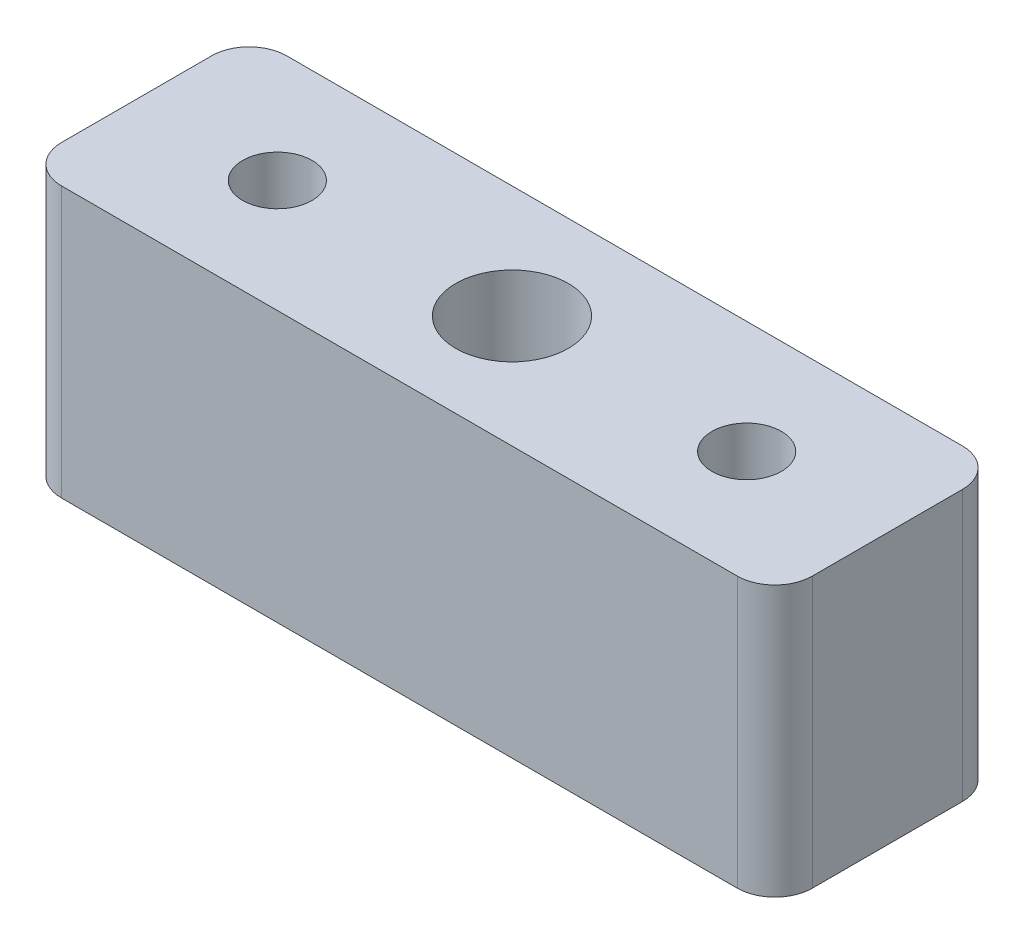
ISO-10303-21;
HEADER;
FILE_DESCRIPTION(('STEP AP214'),'2;1');
FILE_NAME('part.step','',(''),(''),'','','');
FILE_SCHEMA(('AUTOMOTIVE_DESIGN { 1 0 10303 214 1 1 1 1 }'));
ENDSEC;
DATA;
#1=APPLICATION_CONTEXT('core data for automotive mechanical design processes');
#2=APPLICATION_PROTOCOL_DEFINITION('international standard','automotive_design',2000,#1);
#3=PRODUCT_CONTEXT('',#1,'mechanical');
#4=PRODUCT('Part','Part','',(#3));
#5=PRODUCT_RELATED_PRODUCT_CATEGORY('part','',(#4));
#6=PRODUCT_DEFINITION_FORMATION('','',#4);
#7=PRODUCT_DEFINITION_CONTEXT('part definition',#1,'design');
#8=PRODUCT_DEFINITION('design','',#6,#7);
#9=PRODUCT_DEFINITION_SHAPE('','',#8);
#10=(LENGTH_UNIT() NAMED_UNIT(*) SI_UNIT(.MILLI.,.METRE.));
#11=(NAMED_UNIT(*) PLANE_ANGLE_UNIT() SI_UNIT($,.RADIAN.));
#12=(NAMED_UNIT(*) SI_UNIT($,.STERADIAN.) SOLID_ANGLE_UNIT());
#13=UNCERTAINTY_MEASURE_WITH_UNIT(LENGTH_MEASURE(1.E-05),#10,'distance_accuracy_value','');
#14=(GEOMETRIC_REPRESENTATION_CONTEXT(3) GLOBAL_UNCERTAINTY_ASSIGNED_CONTEXT((#13)) GLOBAL_UNIT_ASSIGNED_CONTEXT((#10,
#11,#12)) REPRESENTATION_CONTEXT('',''));
#15=CARTESIAN_POINT('',(0.,0.,0.));
#16=DIRECTION('',(0.,0.,1.));
#17=DIRECTION('',(1.,0.,0.));
#18=AXIS2_PLACEMENT_3D('',#15,#16,#17);
#19=CARTESIAN_POINT('',(0.,14.4,0.));
#20=DIRECTION('',(0.,1.,0.));
#21=DIRECTION('',(0.,0.,1.));
#22=AXIS2_PLACEMENT_3D('',#19,#20,#21);
#23=PLANE('',#22);
#24=CARTESIAN_POINT('',(0.,14.4,0.));
#25=DIRECTION('',(0.,1.,0.));
#26=DIRECTION('',(0.,0.,1.));
#27=AXIS2_PLACEMENT_3D('',#24,#25,#26);
#28=CIRCLE('',#27,3.);
#29=CARTESIAN_POINT('',(0.,14.4,3.));
#30=VERTEX_POINT('',#29);
#31=EDGE_CURVE('E197',#30,#30,#28,.T.);
#32=ORIENTED_EDGE('',*,*,#31,.F.);
#33=EDGE_LOOP('',(#32));
#34=FACE_BOUND('',#33,.T.);
#35=CARTESIAN_POINT('',(-12.5,14.4,0.));
#36=DIRECTION('',(0.,1.,0.));
#37=DIRECTION('',(0.,0.,1.));
#38=AXIS2_PLACEMENT_3D('',#35,#36,#37);
#39=CIRCLE('',#38,1.85);
#40=CARTESIAN_POINT('',(-12.5,14.4,1.85));
#41=VERTEX_POINT('',#40);
#42=EDGE_CURVE('E136',#41,#41,#39,.T.);
#43=ORIENTED_EDGE('',*,*,#42,.F.);
#44=EDGE_LOOP('',(#43));
#45=FACE_BOUND('',#44,.T.);
#46=DIRECTION('',(1.,0.,0.));
#47=VECTOR('',#46,1.);
#48=CARTESIAN_POINT('',(-20.,14.4,6.));
#49=LINE('',#48,#47);
#50=CARTESIAN_POINT('',(-18.,14.4,6.));
#51=VERTEX_POINT('',#50);
#52=CARTESIAN_POINT('',(18.,14.4,6.));
#53=VERTEX_POINT('',#52);
#54=EDGE_CURVE('E145',#51,#53,#49,.T.);
#55=ORIENTED_EDGE('',*,*,#54,.T.);
#56=CARTESIAN_POINT('',(18.,14.4,4.));
#57=DIRECTION('',(0.,1.,0.));
#58=DIRECTION('',(0.,0.,1.));
#59=AXIS2_PLACEMENT_3D('',#56,#57,#58);
#60=CIRCLE('',#59,2.);
#61=CARTESIAN_POINT('',(20.,14.4,4.));
#62=VERTEX_POINT('',#61);
#63=EDGE_CURVE('E163',#53,#62,#60,.T.);
#64=ORIENTED_EDGE('',*,*,#63,.T.);
#65=DIRECTION('',(0.,0.,-1.));
#66=VECTOR('',#65,1.);
#67=CARTESIAN_POINT('',(20.,14.4,-6.));
#68=LINE('',#67,#66);
#69=CARTESIAN_POINT('',(20.,14.4,-4.));
#70=VERTEX_POINT('',#69);
#71=EDGE_CURVE('E127',#62,#70,#68,.T.);
#72=ORIENTED_EDGE('',*,*,#71,.T.);
#73=CARTESIAN_POINT('',(18.,14.4,-4.));
#74=DIRECTION('',(0.,1.,0.));
#75=DIRECTION('',(0.,0.,1.));
#76=AXIS2_PLACEMENT_3D('',#73,#74,#75);
#77=CIRCLE('',#76,2.);
#78=CARTESIAN_POINT('',(18.,14.4,-6.));
#79=VERTEX_POINT('',#78);
#80=EDGE_CURVE('E160',#70,#79,#77,.T.);
#81=ORIENTED_EDGE('',*,*,#80,.T.);
#82=DIRECTION('',(-1.,0.,0.));
#83=VECTOR('',#82,1.);
#84=CARTESIAN_POINT('',(-20.,14.4,-6.));
#85=LINE('',#84,#83);
#86=CARTESIAN_POINT('',(-18.,14.4,-6.));
#87=VERTEX_POINT('',#86);
#88=EDGE_CURVE('E175',#79,#87,#85,.T.);
#89=ORIENTED_EDGE('',*,*,#88,.T.);
#90=CARTESIAN_POINT('',(-18.,14.4,-4.));
#91=DIRECTION('',(0.,1.,0.));
#92=DIRECTION('',(0.,0.,1.));
#93=AXIS2_PLACEMENT_3D('',#90,#91,#92);
#94=CIRCLE('',#93,2.);
#95=CARTESIAN_POINT('',(-20.,14.4,-4.));
#96=VERTEX_POINT('',#95);
#97=EDGE_CURVE('E63',#87,#96,#94,.T.);
#98=ORIENTED_EDGE('',*,*,#97,.T.);
#99=DIRECTION('',(0.,0.,1.));
#100=VECTOR('',#99,1.);
#101=CARTESIAN_POINT('',(-20.,14.4,-6.));
#102=LINE('',#101,#100);
#103=CARTESIAN_POINT('',(-20.,14.4,4.));
#104=VERTEX_POINT('',#103);
#105=EDGE_CURVE('E183',#96,#104,#102,.T.);
#106=ORIENTED_EDGE('',*,*,#105,.T.);
#107=CARTESIAN_POINT('',(-18.,14.4,4.));
#108=DIRECTION('',(0.,1.,0.));
#109=DIRECTION('',(0.,0.,1.));
#110=AXIS2_PLACEMENT_3D('',#107,#108,#109);
#111=CIRCLE('',#110,2.);
#112=EDGE_CURVE('E158',#104,#51,#111,.T.);
#113=ORIENTED_EDGE('',*,*,#112,.T.);
#114=EDGE_LOOP('',(#55,#64,#72,#81,#89,#98,#106,#113));
#115=FACE_BOUND('',#114,.T.);
#116=CARTESIAN_POINT('',(12.5,14.4,0.));
#117=DIRECTION('',(0.,1.,0.));
#118=DIRECTION('',(0.,0.,1.));
#119=AXIS2_PLACEMENT_3D('',#116,#117,#118);
#120=CIRCLE('',#119,1.85);
#121=CARTESIAN_POINT('',(12.5,14.4,1.85));
#122=VERTEX_POINT('',#121);
#123=EDGE_CURVE('E190',#122,#122,#120,.T.);
#124=ORIENTED_EDGE('',*,*,#123,.F.);
#125=EDGE_LOOP('',(#124));
#126=FACE_BOUND('',#125,.T.);
#127=ADVANCED_FACE('F40',(#34,#45,#115,#126),#23,.T.);
#128=CARTESIAN_POINT('',(0.,0.,0.));
#129=DIRECTION('',(0.,1.,0.));
#130=DIRECTION('',(0.,0.,1.));
#131=AXIS2_PLACEMENT_3D('',#128,#129,#130);
#132=PLANE('',#131);
#133=CARTESIAN_POINT('',(0.,0.,0.));
#134=DIRECTION('',(0.,1.,0.));
#135=DIRECTION('',(0.,0.,1.));
#136=AXIS2_PLACEMENT_3D('',#133,#134,#135);
#137=CIRCLE('',#136,3.);
#138=CARTESIAN_POINT('',(0.,0.,3.));
#139=VERTEX_POINT('',#138);
#140=EDGE_CURVE('E44',#139,#139,#137,.T.);
#141=ORIENTED_EDGE('',*,*,#140,.T.);
#142=EDGE_LOOP('',(#141));
#143=FACE_BOUND('',#142,.T.);
#144=DIRECTION('',(0.,0.,-1.));
#145=VECTOR('',#144,1.);
#146=CARTESIAN_POINT('',(20.,0.,-6.));
#147=LINE('',#146,#145);
#148=CARTESIAN_POINT('',(20.,0.,4.));
#149=VERTEX_POINT('',#148);
#150=CARTESIAN_POINT('',(20.,0.,-4.));
#151=VERTEX_POINT('',#150);
#152=EDGE_CURVE('E124',#149,#151,#147,.T.);
#153=ORIENTED_EDGE('',*,*,#152,.F.);
#154=CARTESIAN_POINT('',(18.,0.,4.));
#155=DIRECTION('',(0.,1.,0.));
#156=DIRECTION('',(0.,0.,1.));
#157=AXIS2_PLACEMENT_3D('',#154,#155,#156);
#158=CIRCLE('',#157,2.);
#159=CARTESIAN_POINT('',(18.,0.,6.));
#160=VERTEX_POINT('',#159);
#161=EDGE_CURVE('E107',#149,#160,#158,.F.);
#162=ORIENTED_EDGE('',*,*,#161,.T.);
#163=DIRECTION('',(1.,0.,0.));
#164=VECTOR('',#163,1.);
#165=CARTESIAN_POINT('',(-20.,0.,6.));
#166=LINE('',#165,#164);
#167=CARTESIAN_POINT('',(-18.,0.,6.));
#168=VERTEX_POINT('',#167);
#169=EDGE_CURVE('E149',#168,#160,#166,.T.);
#170=ORIENTED_EDGE('',*,*,#169,.F.);
#171=CARTESIAN_POINT('',(-18.,0.,4.));
#172=DIRECTION('',(0.,1.,0.));
#173=DIRECTION('',(0.,0.,1.));
#174=AXIS2_PLACEMENT_3D('',#171,#172,#173);
#175=CIRCLE('',#174,2.);
#176=CARTESIAN_POINT('',(-20.,0.,4.));
#177=VERTEX_POINT('',#176);
#178=EDGE_CURVE('E128',#168,#177,#175,.F.);
#179=ORIENTED_EDGE('',*,*,#178,.T.);
#180=DIRECTION('',(0.,0.,1.));
#181=VECTOR('',#180,1.);
#182=CARTESIAN_POINT('',(-20.,0.,-6.));
#183=LINE('',#182,#181);
#184=CARTESIAN_POINT('',(-20.,0.,-4.));
#185=VERTEX_POINT('',#184);
#186=EDGE_CURVE('E139',#185,#177,#183,.T.);
#187=ORIENTED_EDGE('',*,*,#186,.F.);
#188=CARTESIAN_POINT('',(-18.,0.,-4.));
#189=DIRECTION('',(0.,1.,0.));
#190=DIRECTION('',(0.,0.,1.));
#191=AXIS2_PLACEMENT_3D('',#188,#189,#190);
#192=CIRCLE('',#191,2.);
#193=CARTESIAN_POINT('',(-18.,0.,-6.));
#194=VERTEX_POINT('',#193);
#195=EDGE_CURVE('E118',#185,#194,#192,.F.);
#196=ORIENTED_EDGE('',*,*,#195,.T.);
#197=DIRECTION('',(-1.,0.,0.));
#198=VECTOR('',#197,1.);
#199=CARTESIAN_POINT('',(-20.,0.,-6.));
#200=LINE('',#199,#198);
#201=CARTESIAN_POINT('',(18.,0.,-6.));
#202=VERTEX_POINT('',#201);
#203=EDGE_CURVE('E135',#202,#194,#200,.T.);
#204=ORIENTED_EDGE('',*,*,#203,.F.);
#205=CARTESIAN_POINT('',(18.,0.,-4.));
#206=DIRECTION('',(0.,1.,0.));
#207=DIRECTION('',(0.,0.,1.));
#208=AXIS2_PLACEMENT_3D('',#205,#206,#207);
#209=CIRCLE('',#208,2.);
#210=EDGE_CURVE('E134',#202,#151,#209,.F.);
#211=ORIENTED_EDGE('',*,*,#210,.T.);
#212=EDGE_LOOP('',(#153,#162,#170,#179,#187,#196,#204,#211));
#213=FACE_BOUND('',#212,.T.);
#214=CARTESIAN_POINT('',(-12.5,0.,0.));
#215=DIRECTION('',(0.,1.,0.));
#216=DIRECTION('',(0.,0.,1.));
#217=AXIS2_PLACEMENT_3D('',#214,#215,#216);
#218=CIRCLE('',#217,1.85);
#219=CARTESIAN_POINT('',(-12.5,0.,1.85));
#220=VERTEX_POINT('',#219);
#221=EDGE_CURVE('E142',#220,#220,#218,.T.);
#222=ORIENTED_EDGE('',*,*,#221,.T.);
#223=EDGE_LOOP('',(#222));
#224=FACE_BOUND('',#223,.T.);
#225=CARTESIAN_POINT('',(12.5,0.,0.));
#226=DIRECTION('',(0.,1.,0.));
#227=DIRECTION('',(0.,0.,1.));
#228=AXIS2_PLACEMENT_3D('',#225,#226,#227);
#229=CIRCLE('',#228,1.85);
#230=CARTESIAN_POINT('',(12.5,0.,1.85));
#231=VERTEX_POINT('',#230);
#232=EDGE_CURVE('E192',#231,#231,#229,.T.);
#233=ORIENTED_EDGE('',*,*,#232,.T.);
#234=EDGE_LOOP('',(#233));
#235=FACE_BOUND('',#234,.T.);
#236=ADVANCED_FACE('F131',(#143,#213,#224,#235),#132,.F.);
#237=CARTESIAN_POINT('',(20.,14.4,-6.));
#238=DIRECTION('',(-1.,0.,0.));
#239=DIRECTION('',(0.,0.,1.));
#240=AXIS2_PLACEMENT_3D('',#237,#238,#239);
#241=PLANE('',#240);
#242=ORIENTED_EDGE('',*,*,#71,.F.);
#243=DIRECTION('',(0.,-1.,0.));
#244=VECTOR('',#243,1.);
#245=CARTESIAN_POINT('',(20.,14.4,4.));
#246=LINE('',#245,#244);
#247=EDGE_CURVE('E111',#62,#149,#246,.T.);
#248=ORIENTED_EDGE('',*,*,#247,.T.);
#249=ORIENTED_EDGE('',*,*,#152,.T.);
#250=DIRECTION('',(0.,-1.,0.));
#251=VECTOR('',#250,1.);
#252=CARTESIAN_POINT('',(20.,14.4,-4.));
#253=LINE('',#252,#251);
#254=EDGE_CURVE('E129',#151,#70,#253,.F.);
#255=ORIENTED_EDGE('',*,*,#254,.T.);
#256=EDGE_LOOP('',(#242,#248,#249,#255));
#257=FACE_BOUND('',#256,.T.);
#258=ADVANCED_FACE('F123',(#257),#241,.F.);
#259=CARTESIAN_POINT('',(-20.,14.4,-6.));
#260=DIRECTION('',(0.,0.,1.));
#261=DIRECTION('',(1.,0.,0.));
#262=AXIS2_PLACEMENT_3D('',#259,#260,#261);
#263=PLANE('',#262);
#264=ORIENTED_EDGE('',*,*,#203,.T.);
#265=DIRECTION('',(0.,-1.,0.));
#266=VECTOR('',#265,1.);
#267=CARTESIAN_POINT('',(-18.,14.4,-6.));
#268=LINE('',#267,#266);
#269=EDGE_CURVE('E11',#194,#87,#268,.F.);
#270=ORIENTED_EDGE('',*,*,#269,.T.);
#271=ORIENTED_EDGE('',*,*,#88,.F.);
#272=DIRECTION('',(0.,-1.,0.));
#273=VECTOR('',#272,1.);
#274=CARTESIAN_POINT('',(18.,14.4,-6.));
#275=LINE('',#274,#273);
#276=EDGE_CURVE('E49',#79,#202,#275,.T.);
#277=ORIENTED_EDGE('',*,*,#276,.T.);
#278=EDGE_LOOP('',(#264,#270,#271,#277));
#279=FACE_BOUND('',#278,.T.);
#280=ADVANCED_FACE('F173',(#279),#263,.F.);
#281=CARTESIAN_POINT('',(-20.,14.4,-6.));
#282=DIRECTION('',(1.,0.,0.));
#283=DIRECTION('',(0.,0.,-1.));
#284=AXIS2_PLACEMENT_3D('',#281,#282,#283);
#285=PLANE('',#284);
#286=ORIENTED_EDGE('',*,*,#105,.F.);
#287=DIRECTION('',(0.,-1.,0.));
#288=VECTOR('',#287,1.);
#289=CARTESIAN_POINT('',(-20.,14.4,-4.));
#290=LINE('',#289,#288);
#291=EDGE_CURVE('E166',#96,#185,#290,.T.);
#292=ORIENTED_EDGE('',*,*,#291,.T.);
#293=ORIENTED_EDGE('',*,*,#186,.T.);
#294=DIRECTION('',(0.,-1.,0.));
#295=VECTOR('',#294,1.);
#296=CARTESIAN_POINT('',(-20.,14.4,4.));
#297=LINE('',#296,#295);
#298=EDGE_CURVE('E56',#177,#104,#297,.F.);
#299=ORIENTED_EDGE('',*,*,#298,.T.);
#300=EDGE_LOOP('',(#286,#292,#293,#299));
#301=FACE_BOUND('',#300,.T.);
#302=ADVANCED_FACE('F182',(#301),#285,.F.);
#303=CARTESIAN_POINT('',(-20.,14.4,6.));
#304=DIRECTION('',(0.,0.,-1.));
#305=DIRECTION('',(-1.,0.,0.));
#306=AXIS2_PLACEMENT_3D('',#303,#304,#305);
#307=PLANE('',#306);
#308=ORIENTED_EDGE('',*,*,#169,.T.);
#309=DIRECTION('',(0.,-1.,0.));
#310=VECTOR('',#309,1.);
#311=CARTESIAN_POINT('',(18.,14.4,6.));
#312=LINE('',#311,#310);
#313=EDGE_CURVE('E112',#160,#53,#312,.F.);
#314=ORIENTED_EDGE('',*,*,#313,.T.);
#315=ORIENTED_EDGE('',*,*,#54,.F.);
#316=DIRECTION('',(0.,-1.,0.));
#317=VECTOR('',#316,1.);
#318=CARTESIAN_POINT('',(-18.,14.4,6.));
#319=LINE('',#318,#317);
#320=EDGE_CURVE('E117',#51,#168,#319,.T.);
#321=ORIENTED_EDGE('',*,*,#320,.T.);
#322=EDGE_LOOP('',(#308,#314,#315,#321));
#323=FACE_BOUND('',#322,.T.);
#324=ADVANCED_FACE('F225',(#323),#307,.F.);
#325=CARTESIAN_POINT('',(-12.5,14.4,0.));
#326=DIRECTION('',(0.,-1.,0.));
#327=DIRECTION('',(0.,0.,-1.));
#328=AXIS2_PLACEMENT_3D('',#325,#326,#327);
#329=CYLINDRICAL_SURFACE('',#328,1.85);
#330=ORIENTED_EDGE('',*,*,#42,.T.);
#331=EDGE_LOOP('',(#330));
#332=FACE_BOUND('',#331,.T.);
#333=ORIENTED_EDGE('',*,*,#221,.F.);
#334=EDGE_LOOP('',(#333));
#335=FACE_BOUND('',#334,.T.);
#336=ADVANCED_FACE('F223',(#332,#335),#329,.F.);
#337=CARTESIAN_POINT('',(12.5,14.4,0.));
#338=DIRECTION('',(0.,-1.,0.));
#339=DIRECTION('',(0.,0.,-1.));
#340=AXIS2_PLACEMENT_3D('',#337,#338,#339);
#341=CYLINDRICAL_SURFACE('',#340,1.85);
#342=ORIENTED_EDGE('',*,*,#123,.T.);
#343=EDGE_LOOP('',(#342));
#344=FACE_BOUND('',#343,.T.);
#345=ORIENTED_EDGE('',*,*,#232,.F.);
#346=EDGE_LOOP('',(#345));
#347=FACE_BOUND('',#346,.T.);
#348=ADVANCED_FACE('F237',(#344,#347),#341,.F.);
#349=CARTESIAN_POINT('',(18.,14.4,4.));
#350=DIRECTION('',(0.,-1.,0.));
#351=DIRECTION('',(0.,0.,-1.));
#352=AXIS2_PLACEMENT_3D('',#349,#350,#351);
#353=CYLINDRICAL_SURFACE('',#352,2.);
#354=ORIENTED_EDGE('',*,*,#63,.F.);
#355=ORIENTED_EDGE('',*,*,#313,.F.);
#356=ORIENTED_EDGE('',*,*,#161,.F.);
#357=ORIENTED_EDGE('',*,*,#247,.F.);
#358=EDGE_LOOP('',(#354,#355,#356,#357));
#359=FACE_BOUND('',#358,.T.);
#360=ADVANCED_FACE('F110',(#359),#353,.T.);
#361=CARTESIAN_POINT('',(-18.,14.4,-4.));
#362=DIRECTION('',(0.,-1.,0.));
#363=DIRECTION('',(0.,0.,-1.));
#364=AXIS2_PLACEMENT_3D('',#361,#362,#363);
#365=CYLINDRICAL_SURFACE('',#364,2.);
#366=ORIENTED_EDGE('',*,*,#97,.F.);
#367=ORIENTED_EDGE('',*,*,#269,.F.);
#368=ORIENTED_EDGE('',*,*,#195,.F.);
#369=ORIENTED_EDGE('',*,*,#291,.F.);
#370=EDGE_LOOP('',(#366,#367,#368,#369));
#371=FACE_BOUND('',#370,.T.);
#372=ADVANCED_FACE('F181',(#371),#365,.T.);
#373=CARTESIAN_POINT('',(18.,14.4,-4.));
#374=DIRECTION('',(0.,-1.,0.));
#375=DIRECTION('',(0.,0.,-1.));
#376=AXIS2_PLACEMENT_3D('',#373,#374,#375);
#377=CYLINDRICAL_SURFACE('',#376,2.);
#378=ORIENTED_EDGE('',*,*,#80,.F.);
#379=ORIENTED_EDGE('',*,*,#254,.F.);
#380=ORIENTED_EDGE('',*,*,#210,.F.);
#381=ORIENTED_EDGE('',*,*,#276,.F.);
#382=EDGE_LOOP('',(#378,#379,#380,#381));
#383=FACE_BOUND('',#382,.T.);
#384=ADVANCED_FACE('F211',(#383),#377,.T.);
#385=CARTESIAN_POINT('',(-18.,14.4,4.));
#386=DIRECTION('',(0.,-1.,0.));
#387=DIRECTION('',(0.,0.,-1.));
#388=AXIS2_PLACEMENT_3D('',#385,#386,#387);
#389=CYLINDRICAL_SURFACE('',#388,2.);
#390=ORIENTED_EDGE('',*,*,#112,.F.);
#391=ORIENTED_EDGE('',*,*,#298,.F.);
#392=ORIENTED_EDGE('',*,*,#178,.F.);
#393=ORIENTED_EDGE('',*,*,#320,.F.);
#394=EDGE_LOOP('',(#390,#391,#392,#393));
#395=FACE_BOUND('',#394,.T.);
#396=ADVANCED_FACE('F42',(#395),#389,.T.);
#397=CARTESIAN_POINT('',(0.,-5.6,0.));
#398=DIRECTION('',(0.,1.,0.));
#399=DIRECTION('',(0.,0.,1.));
#400=AXIS2_PLACEMENT_3D('',#397,#398,#399);
#401=CYLINDRICAL_SURFACE('',#400,3.);
#402=ORIENTED_EDGE('',*,*,#31,.T.);
#403=EDGE_LOOP('',(#402));
#404=FACE_BOUND('',#403,.T.);
#405=ORIENTED_EDGE('',*,*,#140,.F.);
#406=EDGE_LOOP('',(#405));
#407=FACE_BOUND('',#406,.T.);
#408=ADVANCED_FACE('F205',(#404,#407),#401,.F.);
#409=CLOSED_SHELL('',(#127,#236,#258,#280,#302,#324,#336,#348,#360,#372,#384,#396,#408));
#410=MANIFOLD_SOLID_BREP('B2',#409);
#411=ADVANCED_BREP_SHAPE_REPRESENTATION('',(#18,#410),#14);
#412=SHAPE_DEFINITION_REPRESENTATION(#9,#411);
ENDSEC;
END-ISO-10303-21;
